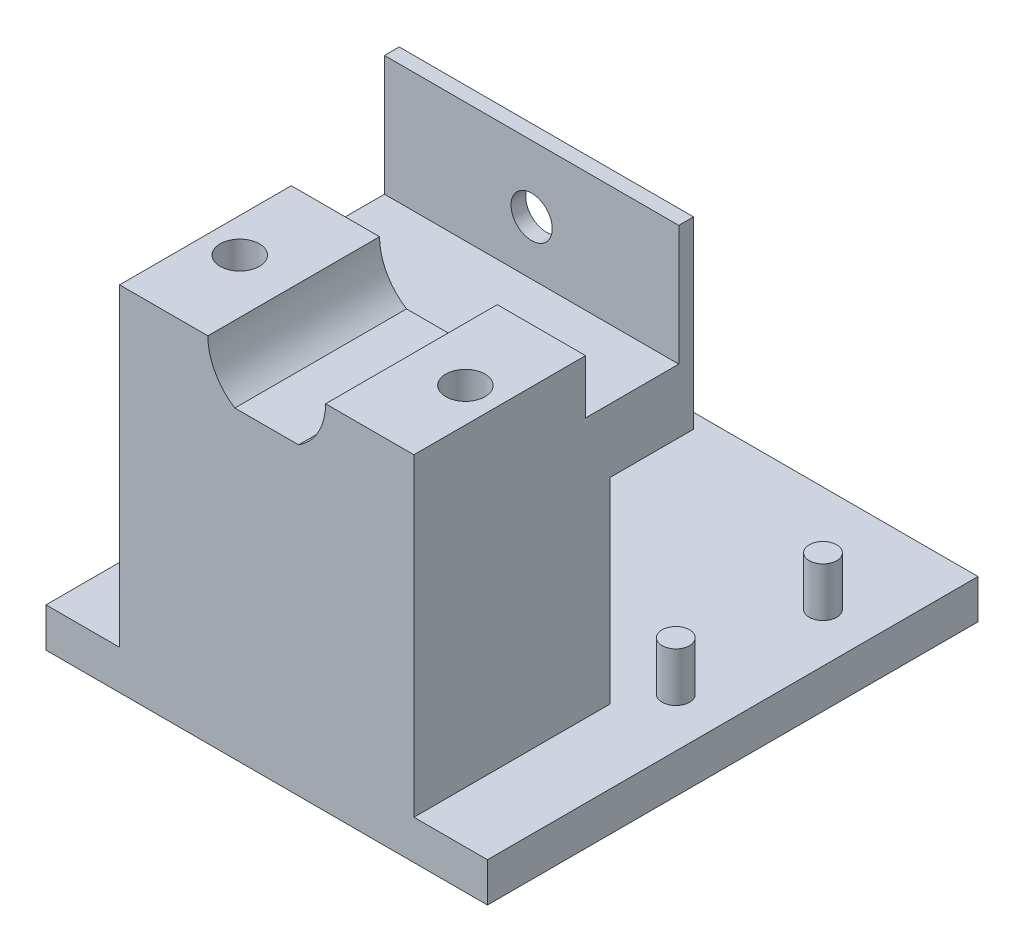
ISO-10303-21;
HEADER;
FILE_DESCRIPTION(('STEP AP214'),'2;1');
FILE_NAME('part.step','',(''),(''),'','','');
FILE_SCHEMA(('AUTOMOTIVE_DESIGN { 1 0 10303 214 1 1 1 1 }'));
ENDSEC;
DATA;
#1=APPLICATION_CONTEXT('core data for automotive mechanical design processes');
#2=APPLICATION_PROTOCOL_DEFINITION('international standard','automotive_design',2000,#1);
#3=PRODUCT_CONTEXT('',#1,'mechanical');
#4=PRODUCT('Part','Part','',(#3));
#5=PRODUCT_RELATED_PRODUCT_CATEGORY('part','',(#4));
#6=PRODUCT_DEFINITION_FORMATION('','',#4);
#7=PRODUCT_DEFINITION_CONTEXT('part definition',#1,'design');
#8=PRODUCT_DEFINITION('design','',#6,#7);
#9=PRODUCT_DEFINITION_SHAPE('','',#8);
#10=(LENGTH_UNIT() NAMED_UNIT(*) SI_UNIT(.MILLI.,.METRE.));
#11=(NAMED_UNIT(*) PLANE_ANGLE_UNIT() SI_UNIT($,.RADIAN.));
#12=(NAMED_UNIT(*) SI_UNIT($,.STERADIAN.) SOLID_ANGLE_UNIT());
#13=UNCERTAINTY_MEASURE_WITH_UNIT(LENGTH_MEASURE(1.E-05),#10,'distance_accuracy_value','');
#14=(GEOMETRIC_REPRESENTATION_CONTEXT(3) GLOBAL_UNCERTAINTY_ASSIGNED_CONTEXT((#13)) GLOBAL_UNIT_ASSIGNED_CONTEXT((#10,
#11,#12)) REPRESENTATION_CONTEXT('',''));
#15=CARTESIAN_POINT('',(0.,0.,0.));
#16=DIRECTION('',(0.,0.,1.));
#17=DIRECTION('',(1.,0.,0.));
#18=AXIS2_PLACEMENT_3D('',#15,#16,#17);
#19=CARTESIAN_POINT('',(-0.0795454545454739,36.0000025251893,-17.5));
#20=DIRECTION('',(0.,0.,1.));
#21=DIRECTION('',(1.,0.,0.));
#22=AXIS2_PLACEMENT_3D('',#19,#20,#21);
#23=PLANE('',#22);
#24=DIRECTION('',(-1.,0.,0.));
#25=VECTOR('',#24,1.);
#26=CARTESIAN_POINT('',(15.,30.5,-17.5));
#27=LINE('',#26,#25);
#28=CARTESIAN_POINT('',(15.,30.5,-17.5));
#29=VERTEX_POINT('',#28);
#30=CARTESIAN_POINT('',(-15.,30.5,-17.5));
#31=VERTEX_POINT('',#30);
#32=EDGE_CURVE('E210',#29,#31,#27,.T.);
#33=ORIENTED_EDGE('',*,*,#32,.T.);
#34=DIRECTION('',(0.,1.,0.));
#35=VECTOR('',#34,1.);
#36=CARTESIAN_POINT('',(-15.,24.,-17.5));
#37=LINE('',#36,#35);
#38=CARTESIAN_POINT('',(-15.,36.0000025251892,-17.5));
#39=VERTEX_POINT('',#38);
#40=EDGE_CURVE('E238',#31,#39,#37,.T.);
#41=ORIENTED_EDGE('',*,*,#40,.T.);
#42=DIRECTION('',(1.,0.,0.));
#43=VECTOR('',#42,1.);
#44=CARTESIAN_POINT('',(-15.,36.0000025251892,-17.5));
#45=LINE('',#44,#43);
#46=CARTESIAN_POINT('',(-6.00000000000002,36.0000025251892,-17.5));
#47=VERTEX_POINT('',#46);
#48=EDGE_CURVE('E241',#39,#47,#45,.T.);
#49=ORIENTED_EDGE('',*,*,#48,.T.);
#50=CARTESIAN_POINT('',(-0.0795454545454739,36.0000025251893,-17.5));
#51=DIRECTION('',(0.,0.,1.));
#52=DIRECTION('',(1.,0.,0.));
#53=AXIS2_PLACEMENT_3D('',#50,#51,#52);
#54=CIRCLE('',#53,5.92045454545454);
#55=CARTESIAN_POINT('',(-3.25,31.0000025251893,-17.5));
#56=VERTEX_POINT('',#55);
#57=EDGE_CURVE('E245',#47,#56,#54,.T.);
#58=ORIENTED_EDGE('',*,*,#57,.T.);
#59=DIRECTION('',(1.,0.,0.));
#60=VECTOR('',#59,1.);
#61=CARTESIAN_POINT('',(3.25,31.0000025251893,-17.5));
#62=LINE('',#61,#60);
#63=CARTESIAN_POINT('',(3.25,31.0000025251893,-17.5));
#64=VERTEX_POINT('',#63);
#65=EDGE_CURVE('E248',#56,#64,#62,.T.);
#66=ORIENTED_EDGE('',*,*,#65,.T.);
#67=CARTESIAN_POINT('',(0.0795454545454739,36.0000025251893,-17.5));
#68=DIRECTION('',(0.,0.,1.));
#69=DIRECTION('',(-1.,0.,0.));
#70=AXIS2_PLACEMENT_3D('',#67,#68,#69);
#71=CIRCLE('',#70,5.92045454545454);
#72=CARTESIAN_POINT('',(6.00000000000002,36.0000025251892,-17.5));
#73=VERTEX_POINT('',#72);
#74=EDGE_CURVE('E251',#64,#73,#71,.T.);
#75=ORIENTED_EDGE('',*,*,#74,.T.);
#76=DIRECTION('',(1.,0.,0.));
#77=VECTOR('',#76,1.);
#78=CARTESIAN_POINT('',(15.,36.0000025251892,-17.5));
#79=LINE('',#78,#77);
#80=CARTESIAN_POINT('',(15.,36.0000025251892,-17.5));
#81=VERTEX_POINT('',#80);
#82=EDGE_CURVE('E254',#73,#81,#79,.T.);
#83=ORIENTED_EDGE('',*,*,#82,.T.);
#84=DIRECTION('',(0.,-1.,0.));
#85=VECTOR('',#84,1.);
#86=CARTESIAN_POINT('',(15.,24.,-17.5));
#87=LINE('',#86,#85);
#88=EDGE_CURVE('E59',#81,#29,#87,.T.);
#89=ORIENTED_EDGE('',*,*,#88,.T.);
#90=EDGE_LOOP('',(#33,#41,#49,#58,#66,#75,#83,#89));
#91=FACE_BOUND('',#90,.T.);
#92=ADVANCED_FACE('F43',(#91),#23,.F.);
#93=CARTESIAN_POINT('',(22.5,4.,0.));
#94=DIRECTION('',(0.,-1.,0.));
#95=DIRECTION('',(0.,0.,-1.));
#96=AXIS2_PLACEMENT_3D('',#93,#94,#95);
#97=PLANE('',#96);
#98=CARTESIAN_POINT('',(17.5,4.,-39.2));
#99=DIRECTION('',(0.,-1.,0.));
#100=DIRECTION('',(0.,0.,-1.));
#101=AXIS2_PLACEMENT_3D('',#98,#99,#100);
#102=CIRCLE('',#101,1.4);
#103=CARTESIAN_POINT('',(17.5,4.,-40.6));
#104=VERTEX_POINT('',#103);
#105=EDGE_CURVE('E52',#104,#104,#102,.F.);
#106=ORIENTED_EDGE('',*,*,#105,.F.);
#107=EDGE_LOOP('',(#106));
#108=FACE_BOUND('',#107,.T.);
#109=CARTESIAN_POINT('',(17.5,4.,-24.2));
#110=DIRECTION('',(0.,-1.,0.));
#111=DIRECTION('',(0.,0.,-1.));
#112=AXIS2_PLACEMENT_3D('',#109,#110,#111);
#113=CIRCLE('',#112,1.4);
#114=CARTESIAN_POINT('',(17.5,4.,-25.6));
#115=VERTEX_POINT('',#114);
#116=EDGE_CURVE('E11',#115,#115,#113,.F.);
#117=ORIENTED_EDGE('',*,*,#116,.F.);
#118=EDGE_LOOP('',(#117));
#119=FACE_BOUND('',#118,.T.);
#120=DIRECTION('',(0.,0.,1.));
#121=VECTOR('',#120,1.);
#122=CARTESIAN_POINT('',(-15.,4.,-20.));
#123=LINE('',#122,#121);
#124=CARTESIAN_POINT('',(-15.,4.,-20.));
#125=VERTEX_POINT('',#124);
#126=CARTESIAN_POINT('',(-15.,4.,0.));
#127=VERTEX_POINT('',#126);
#128=EDGE_CURVE('E297',#125,#127,#123,.T.);
#129=ORIENTED_EDGE('',*,*,#128,.F.);
#130=DIRECTION('',(-1.,0.,0.));
#131=VECTOR('',#130,1.);
#132=CARTESIAN_POINT('',(-15.,4.,-20.));
#133=LINE('',#132,#131);
#134=CARTESIAN_POINT('',(15.,4.,-20.));
#135=VERTEX_POINT('',#134);
#136=EDGE_CURVE('E67',#135,#125,#133,.T.);
#137=ORIENTED_EDGE('',*,*,#136,.F.);
#138=DIRECTION('',(0.,0.,-1.));
#139=VECTOR('',#138,1.);
#140=CARTESIAN_POINT('',(15.,4.,-20.));
#141=LINE('',#140,#139);
#142=CARTESIAN_POINT('',(15.,4.,0.));
#143=VERTEX_POINT('',#142);
#144=EDGE_CURVE('E305',#143,#135,#141,.T.);
#145=ORIENTED_EDGE('',*,*,#144,.F.);
#146=DIRECTION('',(-1.,0.,0.));
#147=VECTOR('',#146,1.);
#148=CARTESIAN_POINT('',(22.5,4.,0.));
#149=LINE('',#148,#147);
#150=CARTESIAN_POINT('',(22.5,4.,0.));
#151=VERTEX_POINT('',#150);
#152=EDGE_CURVE('E359',#151,#143,#149,.T.);
#153=ORIENTED_EDGE('',*,*,#152,.F.);
#154=DIRECTION('',(0.,0.,1.));
#155=VECTOR('',#154,1.);
#156=CARTESIAN_POINT('',(22.5,4.,0.));
#157=LINE('',#156,#155);
#158=CARTESIAN_POINT('',(22.5,4.,-50.));
#159=VERTEX_POINT('',#158);
#160=EDGE_CURVE('E343',#159,#151,#157,.T.);
#161=ORIENTED_EDGE('',*,*,#160,.F.);
#162=DIRECTION('',(-1.,0.,0.));
#163=VECTOR('',#162,1.);
#164=CARTESIAN_POINT('',(22.5,4.,-50.));
#165=LINE('',#164,#163);
#166=CARTESIAN_POINT('',(-22.5,4.,-50.));
#167=VERTEX_POINT('',#166);
#168=EDGE_CURVE('E363',#159,#167,#165,.T.);
#169=ORIENTED_EDGE('',*,*,#168,.T.);
#170=DIRECTION('',(0.,0.,1.));
#171=VECTOR('',#170,1.);
#172=CARTESIAN_POINT('',(-22.5,4.,0.));
#173=LINE('',#172,#171);
#174=CARTESIAN_POINT('',(-22.5,4.,0.));
#175=VERTEX_POINT('',#174);
#176=EDGE_CURVE('E337',#167,#175,#173,.T.);
#177=ORIENTED_EDGE('',*,*,#176,.T.);
#178=EDGE_CURVE('E346',#127,#175,#149,.T.);
#179=ORIENTED_EDGE('',*,*,#178,.F.);
#180=EDGE_LOOP('',(#129,#137,#145,#153,#161,#169,#177,#179));
#181=FACE_BOUND('',#180,.T.);
#182=ADVANCED_FACE('F380',(#108,#119,#181),#97,.F.);
#183=CARTESIAN_POINT('',(22.5,4.,0.));
#184=DIRECTION('',(0.,0.,-1.));
#185=DIRECTION('',(-1.,0.,0.));
#186=AXIS2_PLACEMENT_3D('',#183,#184,#185);
#187=PLANE('',#186);
#188=DIRECTION('',(0.,-1.,0.));
#189=VECTOR('',#188,1.);
#190=CARTESIAN_POINT('',(-22.5,4.,0.));
#191=LINE('',#190,#189);
#192=CARTESIAN_POINT('',(-22.5,0.,0.));
#193=VERTEX_POINT('',#192);
#194=EDGE_CURVE('E331',#175,#193,#191,.T.);
#195=ORIENTED_EDGE('',*,*,#194,.T.);
#196=DIRECTION('',(-1.,0.,0.));
#197=VECTOR('',#196,1.);
#198=CARTESIAN_POINT('',(22.5,0.,0.));
#199=LINE('',#198,#197);
#200=CARTESIAN_POINT('',(22.5,0.,0.));
#201=VERTEX_POINT('',#200);
#202=EDGE_CURVE('E371',#201,#193,#199,.T.);
#203=ORIENTED_EDGE('',*,*,#202,.F.);
#204=DIRECTION('',(0.,-1.,0.));
#205=VECTOR('',#204,1.);
#206=CARTESIAN_POINT('',(22.5,4.,0.));
#207=LINE('',#206,#205);
#208=EDGE_CURVE('E332',#151,#201,#207,.T.);
#209=ORIENTED_EDGE('',*,*,#208,.F.);
#210=ORIENTED_EDGE('',*,*,#152,.T.);
#211=DIRECTION('',(0.,-1.,0.));
#212=VECTOR('',#211,1.);
#213=CARTESIAN_POINT('',(15.,24.,0.));
#214=LINE('',#213,#212);
#215=CARTESIAN_POINT('',(15.,36.0000025251892,0.));
#216=VERTEX_POINT('',#215);
#217=EDGE_CURVE('E315',#216,#143,#214,.T.);
#218=ORIENTED_EDGE('',*,*,#217,.F.);
#219=DIRECTION('',(1.,0.,0.));
#220=VECTOR('',#219,1.);
#221=CARTESIAN_POINT('',(15.,36.0000025251892,0.));
#222=LINE('',#221,#220);
#223=CARTESIAN_POINT('',(6.00000000000002,36.0000025251892,0.));
#224=VERTEX_POINT('',#223);
#225=EDGE_CURVE('E242',#224,#216,#222,.T.);
#226=ORIENTED_EDGE('',*,*,#225,.F.);
#227=CARTESIAN_POINT('',(0.0795454545454739,36.0000025251893,0.));
#228=DIRECTION('',(0.,0.,1.));
#229=DIRECTION('',(-1.,0.,0.));
#230=AXIS2_PLACEMENT_3D('',#227,#228,#229);
#231=CIRCLE('',#230,5.92045454545454);
#232=CARTESIAN_POINT('',(3.25,31.0000025251893,0.));
#233=VERTEX_POINT('',#232);
#234=EDGE_CURVE('E268',#233,#224,#231,.T.);
#235=ORIENTED_EDGE('',*,*,#234,.F.);
#236=DIRECTION('',(1.,0.,0.));
#237=VECTOR('',#236,1.);
#238=CARTESIAN_POINT('',(3.25,31.0000025251893,0.));
#239=LINE('',#238,#237);
#240=CARTESIAN_POINT('',(-3.25,31.0000025251893,0.));
#241=VERTEX_POINT('',#240);
#242=EDGE_CURVE('E265',#241,#233,#239,.T.);
#243=ORIENTED_EDGE('',*,*,#242,.F.);
#244=CARTESIAN_POINT('',(-0.0795454545454739,36.0000025251893,0.));
#245=DIRECTION('',(0.,0.,1.));
#246=DIRECTION('',(1.,0.,0.));
#247=AXIS2_PLACEMENT_3D('',#244,#245,#246);
#248=CIRCLE('',#247,5.92045454545454);
#249=CARTESIAN_POINT('',(-6.00000000000002,36.0000025251892,0.));
#250=VERTEX_POINT('',#249);
#251=EDGE_CURVE('E262',#250,#241,#248,.T.);
#252=ORIENTED_EDGE('',*,*,#251,.F.);
#253=DIRECTION('',(1.,0.,0.));
#254=VECTOR('',#253,1.);
#255=CARTESIAN_POINT('',(-15.,36.0000025251892,0.));
#256=LINE('',#255,#254);
#257=CARTESIAN_POINT('',(-15.,36.0000025251892,0.));
#258=VERTEX_POINT('',#257);
#259=EDGE_CURVE('E191',#258,#250,#256,.T.);
#260=ORIENTED_EDGE('',*,*,#259,.F.);
#261=DIRECTION('',(0.,-1.,0.));
#262=VECTOR('',#261,1.);
#263=CARTESIAN_POINT('',(-15.,24.,0.));
#264=LINE('',#263,#262);
#265=EDGE_CURVE('E319',#258,#127,#264,.T.);
#266=ORIENTED_EDGE('',*,*,#265,.T.);
#267=ORIENTED_EDGE('',*,*,#178,.T.);
#268=EDGE_LOOP('',(#195,#203,#209,#210,#218,#226,#235,#243,#252,#260,#266,#267));
#269=FACE_BOUND('',#268,.T.);
#270=ADVANCED_FACE('F45',(#269),#187,.F.);
#271=CARTESIAN_POINT('',(22.5,0.,0.));
#272=DIRECTION('',(0.,1.,0.));
#273=DIRECTION('',(0.,0.,1.));
#274=AXIS2_PLACEMENT_3D('',#271,#272,#273);
#275=PLANE('',#274);
#276=DIRECTION('',(0.,0.,-1.));
#277=VECTOR('',#276,1.);
#278=CARTESIAN_POINT('',(-22.5,0.,0.));
#279=LINE('',#278,#277);
#280=CARTESIAN_POINT('',(-22.5,0.,-50.));
#281=VERTEX_POINT('',#280);
#282=EDGE_CURVE('E350',#193,#281,#279,.T.);
#283=ORIENTED_EDGE('',*,*,#282,.T.);
#284=DIRECTION('',(-1.,0.,0.));
#285=VECTOR('',#284,1.);
#286=CARTESIAN_POINT('',(22.5,0.,-50.));
#287=LINE('',#286,#285);
#288=CARTESIAN_POINT('',(22.5,0.,-50.));
#289=VERTEX_POINT('',#288);
#290=EDGE_CURVE('E367',#289,#281,#287,.T.);
#291=ORIENTED_EDGE('',*,*,#290,.F.);
#292=DIRECTION('',(0.,0.,-1.));
#293=VECTOR('',#292,1.);
#294=CARTESIAN_POINT('',(22.5,0.,0.));
#295=LINE('',#294,#293);
#296=EDGE_CURVE('E336',#201,#289,#295,.T.);
#297=ORIENTED_EDGE('',*,*,#296,.F.);
#298=ORIENTED_EDGE('',*,*,#202,.T.);
#299=EDGE_LOOP('',(#283,#291,#297,#298));
#300=FACE_BOUND('',#299,.T.);
#301=ADVANCED_FACE('F448',(#300),#275,.F.);
#302=CARTESIAN_POINT('',(22.5,4.,-50.));
#303=DIRECTION('',(0.,0.,1.));
#304=DIRECTION('',(1.,0.,0.));
#305=AXIS2_PLACEMENT_3D('',#302,#303,#304);
#306=PLANE('',#305);
#307=DIRECTION('',(0.,1.,0.));
#308=VECTOR('',#307,1.);
#309=CARTESIAN_POINT('',(-22.5,4.,-50.));
#310=LINE('',#309,#308);
#311=EDGE_CURVE('E353',#281,#167,#310,.T.);
#312=ORIENTED_EDGE('',*,*,#311,.T.);
#313=ORIENTED_EDGE('',*,*,#168,.F.);
#314=DIRECTION('',(0.,1.,0.));
#315=VECTOR('',#314,1.);
#316=CARTESIAN_POINT('',(22.5,4.,-50.));
#317=LINE('',#316,#315);
#318=EDGE_CURVE('E340',#289,#159,#317,.T.);
#319=ORIENTED_EDGE('',*,*,#318,.F.);
#320=ORIENTED_EDGE('',*,*,#290,.T.);
#321=EDGE_LOOP('',(#312,#313,#319,#320));
#322=FACE_BOUND('',#321,.T.);
#323=ADVANCED_FACE('F441',(#322),#306,.F.);
#324=CARTESIAN_POINT('',(22.5,0.,0.));
#325=DIRECTION('',(1.,0.,0.));
#326=DIRECTION('',(0.,0.,-1.));
#327=AXIS2_PLACEMENT_3D('',#324,#325,#326);
#328=PLANE('',#327);
#329=ORIENTED_EDGE('',*,*,#208,.T.);
#330=ORIENTED_EDGE('',*,*,#296,.T.);
#331=ORIENTED_EDGE('',*,*,#318,.T.);
#332=ORIENTED_EDGE('',*,*,#160,.T.);
#333=EDGE_LOOP('',(#329,#330,#331,#332));
#334=FACE_BOUND('',#333,.T.);
#335=ADVANCED_FACE('F437',(#334),#328,.T.);
#336=CARTESIAN_POINT('',(-22.5,0.,0.));
#337=DIRECTION('',(1.,0.,0.));
#338=DIRECTION('',(0.,0.,-1.));
#339=AXIS2_PLACEMENT_3D('',#336,#337,#338);
#340=PLANE('',#339);
#341=ORIENTED_EDGE('',*,*,#194,.F.);
#342=ORIENTED_EDGE('',*,*,#176,.F.);
#343=ORIENTED_EDGE('',*,*,#311,.F.);
#344=ORIENTED_EDGE('',*,*,#282,.F.);
#345=EDGE_LOOP('',(#341,#342,#343,#344));
#346=FACE_BOUND('',#345,.T.);
#347=ADVANCED_FACE('F445',(#346),#340,.F.);
#348=CARTESIAN_POINT('',(17.5,9.00000000000001,-39.2));
#349=DIRECTION('',(0.,-1.,0.));
#350=DIRECTION('',(0.,0.,-1.));
#351=AXIS2_PLACEMENT_3D('',#348,#349,#350);
#352=CYLINDRICAL_SURFACE('',#351,1.4);
#353=CARTESIAN_POINT('',(17.5,9.00000000000001,-39.2));
#354=DIRECTION('',(0.,1.,0.));
#355=DIRECTION('',(0.,0.,1.));
#356=AXIS2_PLACEMENT_3D('',#353,#354,#355);
#357=CIRCLE('',#356,1.4);
#358=CARTESIAN_POINT('',(17.5,9.00000000000001,-37.8));
#359=VERTEX_POINT('',#358);
#360=EDGE_CURVE('E327',#359,#359,#357,.T.);
#361=ORIENTED_EDGE('',*,*,#360,.F.);
#362=EDGE_LOOP('',(#361));
#363=FACE_BOUND('',#362,.T.);
#364=ORIENTED_EDGE('',*,*,#105,.T.);
#365=EDGE_LOOP('',(#364));
#366=FACE_BOUND('',#365,.T.);
#367=ADVANCED_FACE('F378',(#363,#366),#352,.T.);
#368=CARTESIAN_POINT('',(17.5,9.00000000000001,-39.2));
#369=DIRECTION('',(0.,1.,0.));
#370=DIRECTION('',(0.,0.,1.));
#371=AXIS2_PLACEMENT_3D('',#368,#369,#370);
#372=PLANE('',#371);
#373=ORIENTED_EDGE('',*,*,#360,.T.);
#374=EDGE_LOOP('',(#373));
#375=FACE_BOUND('',#374,.T.);
#376=ADVANCED_FACE('F487',(#375),#372,.T.);
#377=CARTESIAN_POINT('',(17.5,9.00000000000001,-24.2));
#378=DIRECTION('',(0.,-1.,0.));
#379=DIRECTION('',(0.,0.,-1.));
#380=AXIS2_PLACEMENT_3D('',#377,#378,#379);
#381=CYLINDRICAL_SURFACE('',#380,1.4);
#382=CARTESIAN_POINT('',(17.5,9.00000000000001,-24.2));
#383=DIRECTION('',(0.,1.,0.));
#384=DIRECTION('',(0.,0.,1.));
#385=AXIS2_PLACEMENT_3D('',#382,#383,#384);
#386=CIRCLE('',#385,1.4);
#387=CARTESIAN_POINT('',(17.5,9.00000000000001,-22.8));
#388=VERTEX_POINT('',#387);
#389=EDGE_CURVE('E323',#388,#388,#386,.T.);
#390=ORIENTED_EDGE('',*,*,#389,.F.);
#391=EDGE_LOOP('',(#390));
#392=FACE_BOUND('',#391,.T.);
#393=ORIENTED_EDGE('',*,*,#116,.T.);
#394=EDGE_LOOP('',(#393));
#395=FACE_BOUND('',#394,.T.);
#396=ADVANCED_FACE('F483',(#392,#395),#381,.T.);
#397=CARTESIAN_POINT('',(17.5,9.00000000000001,-24.2));
#398=DIRECTION('',(0.,1.,0.));
#399=DIRECTION('',(0.,0.,1.));
#400=AXIS2_PLACEMENT_3D('',#397,#398,#399);
#401=PLANE('',#400);
#402=ORIENTED_EDGE('',*,*,#389,.T.);
#403=EDGE_LOOP('',(#402));
#404=FACE_BOUND('',#403,.T.);
#405=ADVANCED_FACE('F480',(#404),#401,.T.);
#406=CARTESIAN_POINT('',(-15.,24.,-20.));
#407=DIRECTION('',(1.,0.,0.));
#408=DIRECTION('',(0.,0.,-1.));
#409=AXIS2_PLACEMENT_3D('',#406,#407,#408);
#410=PLANE('',#409);
#411=ORIENTED_EDGE('',*,*,#128,.T.);
#412=ORIENTED_EDGE('',*,*,#265,.F.);
#413=DIRECTION('',(0.,0.,1.));
#414=VECTOR('',#413,1.);
#415=CARTESIAN_POINT('',(-15.,36.0000025251892,-17.5));
#416=LINE('',#415,#414);
#417=EDGE_CURVE('E293',#39,#258,#416,.T.);
#418=ORIENTED_EDGE('',*,*,#417,.F.);
#419=ORIENTED_EDGE('',*,*,#40,.F.);
#420=DIRECTION('',(0.,0.,1.));
#421=VECTOR('',#420,1.);
#422=CARTESIAN_POINT('',(-15.,30.5,-27.));
#423=LINE('',#422,#421);
#424=CARTESIAN_POINT('',(-15.,30.5,-27.));
#425=VERTEX_POINT('',#424);
#426=EDGE_CURVE('E181',#425,#31,#423,.T.);
#427=ORIENTED_EDGE('',*,*,#426,.F.);
#428=DIRECTION('',(0.,-1.,0.));
#429=VECTOR('',#428,1.);
#430=CARTESIAN_POINT('',(-15.,42.7487886278868,-27.));
#431=LINE('',#430,#429);
#432=CARTESIAN_POINT('',(-15.,42.7487886278868,-27.));
#433=VERTEX_POINT('',#432);
#434=EDGE_CURVE('E220',#433,#425,#431,.T.);
#435=ORIENTED_EDGE('',*,*,#434,.F.);
#436=DIRECTION('',(0.,0.,1.));
#437=VECTOR('',#436,1.);
#438=CARTESIAN_POINT('',(-15.,42.7487886278868,-28.5));
#439=LINE('',#438,#437);
#440=CARTESIAN_POINT('',(-15.,42.7487886278868,-28.5));
#441=VERTEX_POINT('',#440);
#442=EDGE_CURVE('E217',#441,#433,#439,.T.);
#443=ORIENTED_EDGE('',*,*,#442,.F.);
#444=DIRECTION('',(0.,1.,0.));
#445=VECTOR('',#444,1.);
#446=CARTESIAN_POINT('',(-15.,24.,-28.5));
#447=LINE('',#446,#445);
#448=CARTESIAN_POINT('',(-15.,24.,-28.5));
#449=VERTEX_POINT('',#448);
#450=EDGE_CURVE('E213',#449,#441,#447,.T.);
#451=ORIENTED_EDGE('',*,*,#450,.F.);
#452=DIRECTION('',(0.,0.,-1.));
#453=VECTOR('',#452,1.);
#454=CARTESIAN_POINT('',(-15.,24.,-17.5));
#455=LINE('',#454,#453);
#456=CARTESIAN_POINT('',(-15.,24.,-20.));
#457=VERTEX_POINT('',#456);
#458=EDGE_CURVE('E187',#457,#449,#455,.T.);
#459=ORIENTED_EDGE('',*,*,#458,.F.);
#460=DIRECTION('',(0.,-1.,0.));
#461=VECTOR('',#460,1.);
#462=CARTESIAN_POINT('',(-15.,24.,-20.));
#463=LINE('',#462,#461);
#464=EDGE_CURVE('E301',#457,#125,#463,.T.);
#465=ORIENTED_EDGE('',*,*,#464,.T.);
#466=EDGE_LOOP('',(#411,#412,#418,#419,#427,#435,#443,#451,#459,#465));
#467=FACE_BOUND('',#466,.T.);
#468=ADVANCED_FACE('F388',(#467),#410,.F.);
#469=CARTESIAN_POINT('',(15.,24.,-20.));
#470=DIRECTION('',(-1.,0.,0.));
#471=DIRECTION('',(0.,0.,1.));
#472=AXIS2_PLACEMENT_3D('',#469,#470,#471);
#473=PLANE('',#472);
#474=DIRECTION('',(0.,-1.,0.));
#475=VECTOR('',#474,1.);
#476=CARTESIAN_POINT('',(15.,24.,-20.));
#477=LINE('',#476,#475);
#478=CARTESIAN_POINT('',(15.,24.,-20.));
#479=VERTEX_POINT('',#478);
#480=EDGE_CURVE('E176',#479,#135,#477,.T.);
#481=ORIENTED_EDGE('',*,*,#480,.F.);
#482=DIRECTION('',(0.,0.,-1.));
#483=VECTOR('',#482,1.);
#484=CARTESIAN_POINT('',(15.,24.,-17.5));
#485=LINE('',#484,#483);
#486=CARTESIAN_POINT('',(15.,24.,-28.5));
#487=VERTEX_POINT('',#486);
#488=EDGE_CURVE('E169',#479,#487,#485,.T.);
#489=ORIENTED_EDGE('',*,*,#488,.T.);
#490=DIRECTION('',(0.,1.,0.));
#491=VECTOR('',#490,1.);
#492=CARTESIAN_POINT('',(15.,24.,-28.5));
#493=LINE('',#492,#491);
#494=CARTESIAN_POINT('',(15.,42.7487886278868,-28.5));
#495=VERTEX_POINT('',#494);
#496=EDGE_CURVE('E173',#487,#495,#493,.T.);
#497=ORIENTED_EDGE('',*,*,#496,.T.);
#498=DIRECTION('',(0.,0.,1.));
#499=VECTOR('',#498,1.);
#500=CARTESIAN_POINT('',(15.,42.7487886278868,-28.5));
#501=LINE('',#500,#499);
#502=CARTESIAN_POINT('',(15.,42.7487886278868,-27.));
#503=VERTEX_POINT('',#502);
#504=EDGE_CURVE('E198',#495,#503,#501,.T.);
#505=ORIENTED_EDGE('',*,*,#504,.T.);
#506=DIRECTION('',(0.,-1.,0.));
#507=VECTOR('',#506,1.);
#508=CARTESIAN_POINT('',(15.,42.7487886278868,-27.));
#509=LINE('',#508,#507);
#510=CARTESIAN_POINT('',(15.,30.5,-27.));
#511=VERTEX_POINT('',#510);
#512=EDGE_CURVE('E201',#503,#511,#509,.T.);
#513=ORIENTED_EDGE('',*,*,#512,.T.);
#514=DIRECTION('',(0.,0.,1.));
#515=VECTOR('',#514,1.);
#516=CARTESIAN_POINT('',(15.,30.5,-27.));
#517=LINE('',#516,#515);
#518=EDGE_CURVE('E207',#511,#29,#517,.T.);
#519=ORIENTED_EDGE('',*,*,#518,.T.);
#520=ORIENTED_EDGE('',*,*,#88,.F.);
#521=DIRECTION('',(0.,0.,1.));
#522=VECTOR('',#521,1.);
#523=CARTESIAN_POINT('',(15.,36.0000025251892,-17.5));
#524=LINE('',#523,#522);
#525=EDGE_CURVE('E259',#81,#216,#524,.T.);
#526=ORIENTED_EDGE('',*,*,#525,.T.);
#527=ORIENTED_EDGE('',*,*,#217,.T.);
#528=ORIENTED_EDGE('',*,*,#144,.T.);
#529=EDGE_LOOP('',(#481,#489,#497,#505,#513,#519,#520,#526,#527,#528));
#530=FACE_BOUND('',#529,.T.);
#531=ADVANCED_FACE('F171',(#530),#473,.F.);
#532=CARTESIAN_POINT('',(-15.,24.,-20.));
#533=DIRECTION('',(0.,0.,1.));
#534=DIRECTION('',(0.,-1.,0.));
#535=AXIS2_PLACEMENT_3D('',#532,#533,#534);
#536=PLANE('',#535);
#537=ORIENTED_EDGE('',*,*,#136,.T.);
#538=ORIENTED_EDGE('',*,*,#464,.F.);
#539=DIRECTION('',(-1.,0.,0.));
#540=VECTOR('',#539,1.);
#541=CARTESIAN_POINT('',(-15.,24.,-20.));
#542=LINE('',#541,#540);
#543=EDGE_CURVE('E298',#479,#457,#542,.T.);
#544=ORIENTED_EDGE('',*,*,#543,.F.);
#545=ORIENTED_EDGE('',*,*,#480,.T.);
#546=EDGE_LOOP('',(#537,#538,#544,#545));
#547=FACE_BOUND('',#546,.T.);
#548=ADVANCED_FACE('F387',(#547),#536,.F.);
#549=CARTESIAN_POINT('',(-15.,36.0000025251892,-17.5));
#550=DIRECTION('',(0.,-1.,0.));
#551=DIRECTION('',(1.,0.,0.));
#552=AXIS2_PLACEMENT_3D('',#549,#550,#551);
#553=PLANE('',#552);
#554=CARTESIAN_POINT('',(-11.4999999999999,36.0000025251892,-8.75));
#555=DIRECTION('',(0.,1.,0.));
#556=DIRECTION('',(-1.,0.,0.));
#557=AXIS2_PLACEMENT_3D('',#554,#555,#556);
#558=CIRCLE('',#557,2.);
#559=CARTESIAN_POINT('',(-13.4999999999999,36.0000025251892,-8.75));
#560=VERTEX_POINT('',#559);
#561=EDGE_CURVE('E779',#560,#560,#558,.T.);
#562=ORIENTED_EDGE('',*,*,#561,.F.);
#563=EDGE_LOOP('',(#562));
#564=FACE_BOUND('',#563,.T.);
#565=ORIENTED_EDGE('',*,*,#259,.T.);
#566=DIRECTION('',(0.,0.,1.));
#567=VECTOR('',#566,1.);
#568=CARTESIAN_POINT('',(-6.00000000000002,36.0000025251892,-17.5));
#569=LINE('',#568,#567);
#570=EDGE_CURVE('E289',#47,#250,#569,.T.);
#571=ORIENTED_EDGE('',*,*,#570,.F.);
#572=ORIENTED_EDGE('',*,*,#48,.F.);
#573=ORIENTED_EDGE('',*,*,#417,.T.);
#574=EDGE_LOOP('',(#565,#571,#572,#573));
#575=FACE_BOUND('',#574,.T.);
#576=ADVANCED_FACE('F408',(#564,#575),#553,.F.);
#577=CARTESIAN_POINT('',(-0.0795454545454739,36.0000025251893,-17.5));
#578=DIRECTION('',(0.,0.,1.));
#579=DIRECTION('',(1.,0.,0.));
#580=AXIS2_PLACEMENT_3D('',#577,#578,#579);
#581=CYLINDRICAL_SURFACE('',#580,5.92045454545454);
#582=ORIENTED_EDGE('',*,*,#251,.T.);
#583=DIRECTION('',(0.,0.,1.));
#584=VECTOR('',#583,1.);
#585=CARTESIAN_POINT('',(-3.25,31.0000025251893,-17.5));
#586=LINE('',#585,#584);
#587=EDGE_CURVE('E285',#56,#241,#586,.T.);
#588=ORIENTED_EDGE('',*,*,#587,.F.);
#589=ORIENTED_EDGE('',*,*,#57,.F.);
#590=ORIENTED_EDGE('',*,*,#570,.T.);
#591=EDGE_LOOP('',(#582,#588,#589,#590));
#592=FACE_BOUND('',#591,.T.);
#593=ADVANCED_FACE('F413',(#592),#581,.F.);
#594=CARTESIAN_POINT('',(3.25,31.0000025251893,-17.5));
#595=DIRECTION('',(0.,-1.,0.));
#596=DIRECTION('',(0.,0.,-1.));
#597=AXIS2_PLACEMENT_3D('',#594,#595,#596);
#598=PLANE('',#597);
#599=ORIENTED_EDGE('',*,*,#242,.T.);
#600=DIRECTION('',(0.,0.,1.));
#601=VECTOR('',#600,1.);
#602=CARTESIAN_POINT('',(3.25,31.0000025251893,-17.5));
#603=LINE('',#602,#601);
#604=EDGE_CURVE('E281',#64,#233,#603,.T.);
#605=ORIENTED_EDGE('',*,*,#604,.F.);
#606=ORIENTED_EDGE('',*,*,#65,.F.);
#607=ORIENTED_EDGE('',*,*,#587,.T.);
#608=EDGE_LOOP('',(#599,#605,#606,#607));
#609=FACE_BOUND('',#608,.T.);
#610=ADVANCED_FACE('F419',(#609),#598,.F.);
#611=CARTESIAN_POINT('',(0.0795454545454739,36.0000025251893,-17.5));
#612=DIRECTION('',(0.,0.,1.));
#613=DIRECTION('',(1.,0.,0.));
#614=AXIS2_PLACEMENT_3D('',#611,#612,#613);
#615=CYLINDRICAL_SURFACE('',#614,5.92045454545454);
#616=ORIENTED_EDGE('',*,*,#234,.T.);
#617=DIRECTION('',(0.,0.,1.));
#618=VECTOR('',#617,1.);
#619=CARTESIAN_POINT('',(6.00000000000002,36.0000025251892,-17.5));
#620=LINE('',#619,#618);
#621=EDGE_CURVE('E277',#73,#224,#620,.T.);
#622=ORIENTED_EDGE('',*,*,#621,.F.);
#623=ORIENTED_EDGE('',*,*,#74,.F.);
#624=ORIENTED_EDGE('',*,*,#604,.T.);
#625=EDGE_LOOP('',(#616,#622,#623,#624));
#626=FACE_BOUND('',#625,.T.);
#627=ADVANCED_FACE('F423',(#626),#615,.F.);
#628=CARTESIAN_POINT('',(15.,36.0000025251892,-17.5));
#629=DIRECTION('',(0.,-1.,0.));
#630=DIRECTION('',(1.,0.,0.));
#631=AXIS2_PLACEMENT_3D('',#628,#629,#630);
#632=PLANE('',#631);
#633=CARTESIAN_POINT('',(11.5000000000001,36.0000025251892,-8.75));
#634=DIRECTION('',(0.,1.,0.));
#635=DIRECTION('',(-1.,0.,0.));
#636=AXIS2_PLACEMENT_3D('',#633,#634,#635);
#637=CIRCLE('',#636,2.);
#638=CARTESIAN_POINT('',(9.50000000000005,36.0000025251892,-8.75));
#639=VERTEX_POINT('',#638);
#640=EDGE_CURVE('E786',#639,#639,#637,.T.);
#641=ORIENTED_EDGE('',*,*,#640,.F.);
#642=EDGE_LOOP('',(#641));
#643=FACE_BOUND('',#642,.T.);
#644=ORIENTED_EDGE('',*,*,#225,.T.);
#645=ORIENTED_EDGE('',*,*,#525,.F.);
#646=ORIENTED_EDGE('',*,*,#82,.F.);
#647=ORIENTED_EDGE('',*,*,#621,.T.);
#648=EDGE_LOOP('',(#644,#645,#646,#647));
#649=FACE_BOUND('',#648,.T.);
#650=ADVANCED_FACE('F428',(#643,#649),#632,.F.);
#651=CARTESIAN_POINT('',(15.,24.,-17.5));
#652=DIRECTION('',(0.,1.,0.));
#653=DIRECTION('',(0.,0.,1.));
#654=AXIS2_PLACEMENT_3D('',#651,#652,#653);
#655=PLANE('',#654);
#656=ORIENTED_EDGE('',*,*,#488,.F.);
#657=ORIENTED_EDGE('',*,*,#543,.T.);
#658=ORIENTED_EDGE('',*,*,#458,.T.);
#659=DIRECTION('',(-1.,0.,0.));
#660=VECTOR('',#659,1.);
#661=CARTESIAN_POINT('',(15.,24.,-28.5));
#662=LINE('',#661,#660);
#663=EDGE_CURVE('E184',#487,#449,#662,.T.);
#664=ORIENTED_EDGE('',*,*,#663,.F.);
#665=EDGE_LOOP('',(#656,#657,#658,#664));
#666=FACE_BOUND('',#665,.T.);
#667=ADVANCED_FACE('F185',(#666),#655,.F.);
#668=CARTESIAN_POINT('',(15.,24.,-28.5));
#669=DIRECTION('',(0.,0.,1.));
#670=DIRECTION('',(1.,0.,0.));
#671=AXIS2_PLACEMENT_3D('',#668,#669,#670);
#672=PLANE('',#671);
#673=CARTESIAN_POINT('',(0.,36.0000025050797,-28.5));
#674=DIRECTION('',(0.,0.,-1.));
#675=DIRECTION('',(-1.,0.,0.));
#676=AXIS2_PLACEMENT_3D('',#673,#674,#675);
#677=CIRCLE('',#676,2.1);
#678=CARTESIAN_POINT('',(-2.1,36.0000025050797,-28.5));
#679=VERTEX_POINT('',#678);
#680=EDGE_CURVE('E778',#679,#679,#677,.T.);
#681=ORIENTED_EDGE('',*,*,#680,.F.);
#682=EDGE_LOOP('',(#681));
#683=FACE_BOUND('',#682,.T.);
#684=ORIENTED_EDGE('',*,*,#450,.T.);
#685=DIRECTION('',(-1.,0.,0.));
#686=VECTOR('',#685,1.);
#687=CARTESIAN_POINT('',(15.,42.7487886278868,-28.5));
#688=LINE('',#687,#686);
#689=EDGE_CURVE('E192',#495,#441,#688,.T.);
#690=ORIENTED_EDGE('',*,*,#689,.F.);
#691=ORIENTED_EDGE('',*,*,#496,.F.);
#692=ORIENTED_EDGE('',*,*,#663,.T.);
#693=EDGE_LOOP('',(#684,#690,#691,#692));
#694=FACE_BOUND('',#693,.T.);
#695=ADVANCED_FACE('F194',(#683,#694),#672,.F.);
#696=CARTESIAN_POINT('',(15.,42.7487886278868,-28.5));
#697=DIRECTION('',(0.,-1.,0.));
#698=DIRECTION('',(0.,0.,-1.));
#699=AXIS2_PLACEMENT_3D('',#696,#697,#698);
#700=PLANE('',#699);
#701=ORIENTED_EDGE('',*,*,#442,.T.);
#702=DIRECTION('',(-1.,0.,0.));
#703=VECTOR('',#702,1.);
#704=CARTESIAN_POINT('',(15.,42.7487886278868,-27.));
#705=LINE('',#704,#703);
#706=EDGE_CURVE('E232',#503,#433,#705,.T.);
#707=ORIENTED_EDGE('',*,*,#706,.F.);
#708=ORIENTED_EDGE('',*,*,#504,.F.);
#709=ORIENTED_EDGE('',*,*,#689,.T.);
#710=EDGE_LOOP('',(#701,#707,#708,#709));
#711=FACE_BOUND('',#710,.T.);
#712=ADVANCED_FACE('F392',(#711),#700,.F.);
#713=CARTESIAN_POINT('',(15.,42.7487886278868,-27.));
#714=DIRECTION('',(0.,0.,-1.));
#715=DIRECTION('',(0.,1.,0.));
#716=AXIS2_PLACEMENT_3D('',#713,#714,#715);
#717=PLANE('',#716);
#718=CARTESIAN_POINT('',(0.,36.0000025050797,-27.));
#719=DIRECTION('',(0.,0.,-1.));
#720=DIRECTION('',(0.,1.,0.));
#721=AXIS2_PLACEMENT_3D('',#718,#719,#720);
#722=CIRCLE('',#721,2.1);
#723=CARTESIAN_POINT('',(-2.1,36.0000025050797,-27.));
#724=VERTEX_POINT('',#723);
#725=EDGE_CURVE('E214',#724,#724,#722,.F.);
#726=ORIENTED_EDGE('',*,*,#725,.F.);
#727=EDGE_LOOP('',(#726));
#728=FACE_BOUND('',#727,.T.);
#729=ORIENTED_EDGE('',*,*,#434,.T.);
#730=DIRECTION('',(-1.,0.,0.));
#731=VECTOR('',#730,1.);
#732=CARTESIAN_POINT('',(15.,30.5,-27.));
#733=LINE('',#732,#731);
#734=EDGE_CURVE('E228',#511,#425,#733,.T.);
#735=ORIENTED_EDGE('',*,*,#734,.F.);
#736=ORIENTED_EDGE('',*,*,#512,.F.);
#737=ORIENTED_EDGE('',*,*,#706,.T.);
#738=EDGE_LOOP('',(#729,#735,#736,#737));
#739=FACE_BOUND('',#738,.T.);
#740=ADVANCED_FACE('F399',(#728,#739),#717,.F.);
#741=CARTESIAN_POINT('',(15.,30.5,-27.));
#742=DIRECTION('',(0.,-1.,0.));
#743=DIRECTION('',(0.,0.,-1.));
#744=AXIS2_PLACEMENT_3D('',#741,#742,#743);
#745=PLANE('',#744);
#746=ORIENTED_EDGE('',*,*,#426,.T.);
#747=ORIENTED_EDGE('',*,*,#32,.F.);
#748=ORIENTED_EDGE('',*,*,#518,.F.);
#749=ORIENTED_EDGE('',*,*,#734,.T.);
#750=EDGE_LOOP('',(#746,#747,#748,#749));
#751=FACE_BOUND('',#750,.T.);
#752=ADVANCED_FACE('F402',(#751),#745,.F.);
#753=CARTESIAN_POINT('',(0.,36.0000025050797,0.001000000000001));
#754=DIRECTION('',(0.,0.,-1.));
#755=DIRECTION('',(-1.,0.,0.));
#756=AXIS2_PLACEMENT_3D('',#753,#754,#755);
#757=CYLINDRICAL_SURFACE('',#756,2.1);
#758=CARTESIAN_POINT('',(-2.1,36.0000025050797,-28.5));
#759=CARTESIAN_POINT('',(-2.1,36.0000025050797,-28.484375));
#760=CARTESIAN_POINT('',(-2.1,36.0000025050797,-28.46875));
#761=CARTESIAN_POINT('',(-2.1,36.0000025050797,-28.4375));
#762=CARTESIAN_POINT('',(-2.1,36.0000025050797,-28.421875));
#763=CARTESIAN_POINT('',(-2.1,36.0000025050797,-28.390625));
#764=CARTESIAN_POINT('',(-2.1,36.0000025050797,-28.375));
#765=CARTESIAN_POINT('',(-2.1,36.0000025050797,-28.34375));
#766=CARTESIAN_POINT('',(-2.1,36.0000025050797,-28.328125));
#767=CARTESIAN_POINT('',(-2.1,36.0000025050797,-28.296875));
#768=CARTESIAN_POINT('',(-2.1,36.0000025050797,-28.28125));
#769=CARTESIAN_POINT('',(-2.1,36.0000025050797,-28.25));
#770=CARTESIAN_POINT('',(-2.1,36.0000025050797,-28.234375));
#771=CARTESIAN_POINT('',(-2.1,36.0000025050797,-28.203125));
#772=CARTESIAN_POINT('',(-2.1,36.0000025050797,-28.1875));
#773=CARTESIAN_POINT('',(-2.1,36.0000025050797,-28.15625));
#774=CARTESIAN_POINT('',(-2.1,36.0000025050797,-28.140625));
#775=CARTESIAN_POINT('',(-2.1,36.0000025050797,-28.109375));
#776=CARTESIAN_POINT('',(-2.1,36.0000025050797,-28.09375));
#777=CARTESIAN_POINT('',(-2.1,36.0000025050797,-28.0625));
#778=CARTESIAN_POINT('',(-2.1,36.0000025050797,-28.046875));
#779=CARTESIAN_POINT('',(-2.1,36.0000025050797,-28.015625));
#780=CARTESIAN_POINT('',(-2.1,36.0000025050797,-28.));
#781=CARTESIAN_POINT('',(-2.1,36.0000025050797,-27.96875));
#782=CARTESIAN_POINT('',(-2.1,36.0000025050797,-27.953125));
#783=CARTESIAN_POINT('',(-2.1,36.0000025050797,-27.921875));
#784=CARTESIAN_POINT('',(-2.1,36.0000025050797,-27.90625));
#785=CARTESIAN_POINT('',(-2.1,36.0000025050797,-27.875));
#786=CARTESIAN_POINT('',(-2.1,36.0000025050797,-27.859375));
#787=CARTESIAN_POINT('',(-2.1,36.0000025050797,-27.828125));
#788=CARTESIAN_POINT('',(-2.1,36.0000025050797,-27.8125));
#789=CARTESIAN_POINT('',(-2.1,36.0000025050797,-27.78125));
#790=CARTESIAN_POINT('',(-2.1,36.0000025050797,-27.765625));
#791=CARTESIAN_POINT('',(-2.1,36.0000025050797,-27.734375));
#792=CARTESIAN_POINT('',(-2.1,36.0000025050797,-27.71875));
#793=CARTESIAN_POINT('',(-2.1,36.0000025050797,-27.6875));
#794=CARTESIAN_POINT('',(-2.1,36.0000025050797,-27.671875));
#795=CARTESIAN_POINT('',(-2.1,36.0000025050797,-27.640625));
#796=CARTESIAN_POINT('',(-2.1,36.0000025050797,-27.625));
#797=CARTESIAN_POINT('',(-2.1,36.0000025050797,-27.59375));
#798=CARTESIAN_POINT('',(-2.1,36.0000025050797,-27.578125));
#799=CARTESIAN_POINT('',(-2.1,36.0000025050797,-27.546875));
#800=CARTESIAN_POINT('',(-2.1,36.0000025050797,-27.53125));
#801=CARTESIAN_POINT('',(-2.1,36.0000025050797,-27.5));
#802=CARTESIAN_POINT('',(-2.1,36.0000025050797,-27.484375));
#803=CARTESIAN_POINT('',(-2.1,36.0000025050797,-27.453125));
#804=CARTESIAN_POINT('',(-2.1,36.0000025050797,-27.4375));
#805=CARTESIAN_POINT('',(-2.1,36.0000025050797,-27.40625));
#806=CARTESIAN_POINT('',(-2.1,36.0000025050797,-27.390625));
#807=CARTESIAN_POINT('',(-2.1,36.0000025050797,-27.359375));
#808=CARTESIAN_POINT('',(-2.1,36.0000025050797,-27.34375));
#809=CARTESIAN_POINT('',(-2.1,36.0000025050797,-27.3125));
#810=CARTESIAN_POINT('',(-2.1,36.0000025050797,-27.296875));
#811=CARTESIAN_POINT('',(-2.1,36.0000025050797,-27.265625));
#812=CARTESIAN_POINT('',(-2.1,36.0000025050797,-27.25));
#813=CARTESIAN_POINT('',(-2.1,36.0000025050797,-27.21875));
#814=CARTESIAN_POINT('',(-2.1,36.0000025050797,-27.203125));
#815=CARTESIAN_POINT('',(-2.1,36.0000025050797,-27.171875));
#816=CARTESIAN_POINT('',(-2.1,36.0000025050797,-27.15625));
#817=CARTESIAN_POINT('',(-2.1,36.0000025050797,-27.125));
#818=CARTESIAN_POINT('',(-2.1,36.0000025050797,-27.109375));
#819=CARTESIAN_POINT('',(-2.1,36.0000025050797,-27.078125));
#820=CARTESIAN_POINT('',(-2.1,36.0000025050797,-27.0625));
#821=CARTESIAN_POINT('',(-2.1,36.0000025050797,-27.03125));
#822=CARTESIAN_POINT('',(-2.1,36.0000025050797,-27.015625));
#823=CARTESIAN_POINT('',(-2.1,36.0000025050797,-27.));
#824=B_SPLINE_CURVE_WITH_KNOTS('',3,(#758,#759,#760,#761,#762,#763,#764,#765,#766,#767,#768,
#769,#770,#771,#772,#773,#774,#775,#776,#777,#778,#779,#780,#781,#782,#783,#784,#785,#786,#787,
#788,#789,#790,#791,#792,#793,#794,#795,#796,#797,#798,#799,#800,#801,#802,#803,#804,#805,#806,
#807,#808,#809,#810,#811,#812,#813,#814,#815,#816,#817,#818,#819,#820,#821,#822,#823),
.UNSPECIFIED.,.F.,.F.,(4,2,2,2,2,2,2,2,2,2,2,2,2,2,2,2,2,2,2,2,2,2,2,2,2,2,2,2,2,2,2,2,4),(0.,
0.0468750000000018,0.0937500000000001,0.140624999999998,0.1875,0.234375000000002,0.28125,
0.328124999999999,0.375,0.421875000000002,0.46875,0.515624999999999,0.5625,0.609375000000002,
0.656250000000001,0.703124999999999,0.750000000000001,0.796875000000002,0.843750000000001,
0.890624999999999,0.937500000000001,0.984375000000003,1.03125,1.078125,1.125,1.171875,1.21875,
1.265625,1.3125,1.359375,1.40625,1.453125,1.5),.UNSPECIFIED.);
#825=EDGE_CURVE('BSEAM584',#679,#724,#824,.T.);
#826=ORIENTED_EDGE('',*,*,#680,.T.);
#827=ORIENTED_EDGE('',*,*,#725,.T.);
#828=ORIENTED_EDGE('',*,*,#825,.T.);
#829=ORIENTED_EDGE('',*,*,#825,.F.);
#830=EDGE_LOOP('',(#826,#828,#827,#829));
#831=FACE_BOUND('',#830,.T.);
#832=ADVANCED_FACE('F584',(#831),#757,.F.);
#833=CARTESIAN_POINT('',(11.5000000000001,26.0000025251892,-8.75));
#834=DIRECTION('',(0.,1.,0.));
#835=DIRECTION('',(-1.,0.,0.));
#836=AXIS2_PLACEMENT_3D('',#833,#834,#835);
#837=CYLINDRICAL_SURFACE('',#836,2.);
#838=CARTESIAN_POINT('',(11.5000000000001,26.0000025251892,-8.75));
#839=DIRECTION('',(0.,1.,0.));
#840=DIRECTION('',(-1.,0.,0.));
#841=AXIS2_PLACEMENT_3D('',#838,#839,#840);
#842=CIRCLE('',#841,2.);
#843=CARTESIAN_POINT('',(9.50000000000006,26.0000025251892,-8.75));
#844=VERTEX_POINT('',#843);
#845=EDGE_CURVE('E792',#844,#844,#842,.T.);
#846=ORIENTED_EDGE('',*,*,#845,.F.);
#847=EDGE_LOOP('',(#846));
#848=FACE_BOUND('',#847,.T.);
#849=ORIENTED_EDGE('',*,*,#640,.T.);
#850=EDGE_LOOP('',(#849));
#851=FACE_BOUND('',#850,.T.);
#852=ADVANCED_FACE('F590',(#848,#851),#837,.F.);
#853=CARTESIAN_POINT('',(11.5000000000001,26.0000025251892,-8.75));
#854=DIRECTION('',(0.,1.,0.));
#855=DIRECTION('',(-1.,0.,0.));
#856=AXIS2_PLACEMENT_3D('',#853,#854,#855);
#857=PLANE('',#856);
#858=ORIENTED_EDGE('',*,*,#845,.T.);
#859=EDGE_LOOP('',(#858));
#860=FACE_BOUND('',#859,.T.);
#861=ADVANCED_FACE('F597',(#860),#857,.T.);
#862=CARTESIAN_POINT('',(-11.4999999999999,26.0000025251892,-8.75));
#863=DIRECTION('',(0.,1.,0.));
#864=DIRECTION('',(-1.,0.,0.));
#865=AXIS2_PLACEMENT_3D('',#862,#863,#864);
#866=CYLINDRICAL_SURFACE('',#865,2.);
#867=CARTESIAN_POINT('',(-11.4999999999999,26.0000025251892,-8.75));
#868=DIRECTION('',(0.,1.,0.));
#869=DIRECTION('',(-1.,0.,0.));
#870=AXIS2_PLACEMENT_3D('',#867,#868,#869);
#871=CIRCLE('',#870,2.);
#872=CARTESIAN_POINT('',(-13.4999999999999,26.0000025251892,-8.75));
#873=VERTEX_POINT('',#872);
#874=EDGE_CURVE('E776',#873,#873,#871,.T.);
#875=ORIENTED_EDGE('',*,*,#874,.F.);
#876=EDGE_LOOP('',(#875));
#877=FACE_BOUND('',#876,.T.);
#878=ORIENTED_EDGE('',*,*,#561,.T.);
#879=EDGE_LOOP('',(#878));
#880=FACE_BOUND('',#879,.T.);
#881=ADVANCED_FACE('F605',(#877,#880),#866,.F.);
#882=CARTESIAN_POINT('',(-11.4999999999999,26.0000025251892,-8.75));
#883=DIRECTION('',(0.,1.,0.));
#884=DIRECTION('',(-1.,0.,0.));
#885=AXIS2_PLACEMENT_3D('',#882,#883,#884);
#886=PLANE('',#885);
#887=ORIENTED_EDGE('',*,*,#874,.T.);
#888=EDGE_LOOP('',(#887));
#889=FACE_BOUND('',#888,.T.);
#890=ADVANCED_FACE('F613',(#889),#886,.T.);
#891=CLOSED_SHELL('',(#92,#182,#270,#301,#323,#335,#347,#367,#376,#396,#405,#468,#531,#548,#576,
#593,#610,#627,#650,#667,#695,#712,#740,#752,#832,#852,#861,#881,#890));
#892=MANIFOLD_SOLID_BREP('B2',#891);
#893=ADVANCED_BREP_SHAPE_REPRESENTATION('',(#18,#892),#14);
#894=SHAPE_DEFINITION_REPRESENTATION(#9,#893);
ENDSEC;
END-ISO-10303-21;
